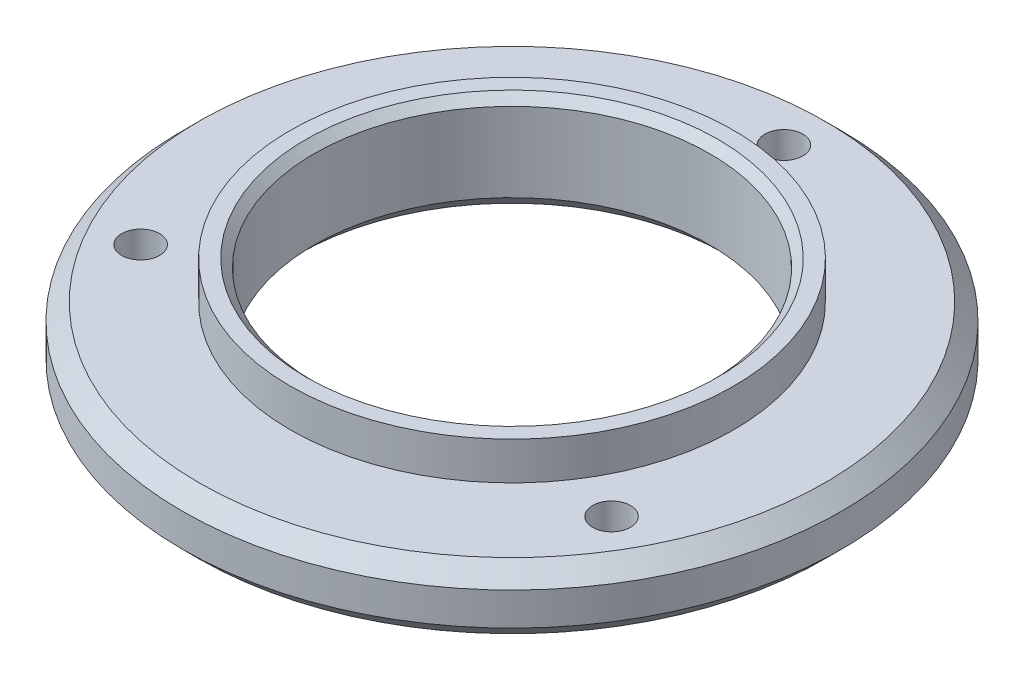
ISO-10303-21;
HEADER;
FILE_DESCRIPTION(('STEP AP214'),'2;1');
FILE_NAME('part.step','',(''),(''),'','','');
FILE_SCHEMA(('AUTOMOTIVE_DESIGN { 1 0 10303 214 1 1 1 1 }'));
ENDSEC;
DATA;
#1=APPLICATION_CONTEXT('core data for automotive mechanical design processes');
#2=APPLICATION_PROTOCOL_DEFINITION('international standard','automotive_design',2000,#1);
#3=PRODUCT_CONTEXT('',#1,'mechanical');
#4=PRODUCT('Part','Part','',(#3));
#5=PRODUCT_RELATED_PRODUCT_CATEGORY('part','',(#4));
#6=PRODUCT_DEFINITION_FORMATION('','',#4);
#7=PRODUCT_DEFINITION_CONTEXT('part definition',#1,'design');
#8=PRODUCT_DEFINITION('design','',#6,#7);
#9=PRODUCT_DEFINITION_SHAPE('','',#8);
#10=(LENGTH_UNIT() NAMED_UNIT(*) SI_UNIT(.MILLI.,.METRE.));
#11=(NAMED_UNIT(*) PLANE_ANGLE_UNIT() SI_UNIT($,.RADIAN.));
#12=(NAMED_UNIT(*) SI_UNIT($,.STERADIAN.) SOLID_ANGLE_UNIT());
#13=UNCERTAINTY_MEASURE_WITH_UNIT(LENGTH_MEASURE(1.E-05),#10,'distance_accuracy_value','');
#14=(GEOMETRIC_REPRESENTATION_CONTEXT(3) GLOBAL_UNCERTAINTY_ASSIGNED_CONTEXT((#13)) GLOBAL_UNIT_ASSIGNED_CONTEXT((#10,
#11,#12)) REPRESENTATION_CONTEXT('',''));
#15=CARTESIAN_POINT('',(0.,0.,0.));
#16=DIRECTION('',(0.,0.,1.));
#17=DIRECTION('',(1.,0.,0.));
#18=AXIS2_PLACEMENT_3D('',#15,#16,#17);
#19=CARTESIAN_POINT('',(0.,4.,-16.5));
#20=DIRECTION('',(0.,-1.,0.));
#21=DIRECTION('',(0.,0.,-1.));
#22=AXIS2_PLACEMENT_3D('',#19,#20,#21);
#23=CYLINDRICAL_SURFACE('',#22,1.15);
#24=CARTESIAN_POINT('',(0.,2.,-16.5));
#25=DIRECTION('',(0.,1.,0.));
#26=DIRECTION('',(0.,0.,1.));
#27=AXIS2_PLACEMENT_3D('',#24,#25,#26);
#28=CIRCLE('',#27,1.15);
#29=CARTESIAN_POINT('',(0.,2.,-15.35));
#30=VERTEX_POINT('',#29);
#31=EDGE_CURVE('E74',#30,#30,#28,.T.);
#32=ORIENTED_EDGE('',*,*,#31,.F.);
#33=EDGE_LOOP('',(#32));
#34=FACE_BOUND('',#33,.T.);
#35=CARTESIAN_POINT('',(0.,4.,-16.5));
#36=DIRECTION('',(0.,1.,0.));
#37=DIRECTION('',(0.,0.,1.));
#38=AXIS2_PLACEMENT_3D('',#35,#36,#37);
#39=CIRCLE('',#38,1.15);
#40=CARTESIAN_POINT('',(0.,4.,-15.35));
#41=VERTEX_POINT('',#40);
#42=EDGE_CURVE('E89',#41,#41,#39,.T.);
#43=ORIENTED_EDGE('',*,*,#42,.T.);
#44=EDGE_LOOP('',(#43));
#45=FACE_BOUND('',#44,.T.);
#46=ADVANCED_FACE('F41',(#34,#45),#23,.F.);
#47=CARTESIAN_POINT('',(14.2894191624432,4.,8.25000000000007));
#48=DIRECTION('',(0.,-1.,0.));
#49=DIRECTION('',(0.,0.,-1.));
#50=AXIS2_PLACEMENT_3D('',#47,#48,#49);
#51=CYLINDRICAL_SURFACE('',#50,1.15);
#52=CARTESIAN_POINT('',(14.2894191624432,2.,8.25000000000007));
#53=DIRECTION('',(0.,1.,0.));
#54=DIRECTION('',(0.,0.,1.));
#55=AXIS2_PLACEMENT_3D('',#52,#53,#54);
#56=CIRCLE('',#55,1.15);
#57=CARTESIAN_POINT('',(14.2894191624432,2.,9.40000000000007));
#58=VERTEX_POINT('',#57);
#59=EDGE_CURVE('E78',#58,#58,#56,.T.);
#60=ORIENTED_EDGE('',*,*,#59,.F.);
#61=EDGE_LOOP('',(#60));
#62=FACE_BOUND('',#61,.T.);
#63=CARTESIAN_POINT('',(14.2894191624432,4.,8.25000000000007));
#64=DIRECTION('',(0.,1.,0.));
#65=DIRECTION('',(0.,0.,1.));
#66=AXIS2_PLACEMENT_3D('',#63,#64,#65);
#67=CIRCLE('',#66,1.15);
#68=CARTESIAN_POINT('',(14.2894191624432,4.,9.40000000000007));
#69=VERTEX_POINT('',#68);
#70=EDGE_CURVE('E92',#69,#69,#67,.T.);
#71=ORIENTED_EDGE('',*,*,#70,.T.);
#72=EDGE_LOOP('',(#71));
#73=FACE_BOUND('',#72,.T.);
#74=ADVANCED_FACE('F139',(#62,#73),#51,.F.);
#75=CARTESIAN_POINT('',(-14.2894191624433,4.,8.24999999999986));
#76=DIRECTION('',(0.,-1.,0.));
#77=DIRECTION('',(0.,0.,-1.));
#78=AXIS2_PLACEMENT_3D('',#75,#76,#77);
#79=CYLINDRICAL_SURFACE('',#78,1.15);
#80=CARTESIAN_POINT('',(-14.2894191624433,2.,8.24999999999986));
#81=DIRECTION('',(0.,1.,0.));
#82=DIRECTION('',(0.,0.,1.));
#83=AXIS2_PLACEMENT_3D('',#80,#81,#82);
#84=CIRCLE('',#83,1.15);
#85=CARTESIAN_POINT('',(-14.2894191624433,2.,9.39999999999986));
#86=VERTEX_POINT('',#85);
#87=EDGE_CURVE('E83',#86,#86,#84,.T.);
#88=ORIENTED_EDGE('',*,*,#87,.F.);
#89=EDGE_LOOP('',(#88));
#90=FACE_BOUND('',#89,.T.);
#91=CARTESIAN_POINT('',(-14.2894191624433,4.,8.24999999999986));
#92=DIRECTION('',(0.,1.,0.));
#93=DIRECTION('',(0.,0.,1.));
#94=AXIS2_PLACEMENT_3D('',#91,#92,#93);
#95=CIRCLE('',#94,1.15);
#96=CARTESIAN_POINT('',(-14.2894191624433,4.,9.39999999999986));
#97=VERTEX_POINT('',#96);
#98=EDGE_CURVE('E87',#97,#97,#95,.T.);
#99=ORIENTED_EDGE('',*,*,#98,.T.);
#100=EDGE_LOOP('',(#99));
#101=FACE_BOUND('',#100,.T.);
#102=ADVANCED_FACE('F147',(#90,#101),#79,.F.);
#103=CARTESIAN_POINT('',(0.,4.,0.));
#104=DIRECTION('',(0.,-1.,0.));
#105=DIRECTION('',(0.,0.,-1.));
#106=AXIS2_PLACEMENT_3D('',#103,#104,#105);
#107=CYLINDRICAL_SURFACE('',#106,12.);
#108=CARTESIAN_POINT('',(0.,1.,0.));
#109=DIRECTION('',(0.,1.,0.));
#110=DIRECTION('',(0.,0.,1.));
#111=AXIS2_PLACEMENT_3D('',#108,#109,#110);
#112=CIRCLE('',#111,12.);
#113=CARTESIAN_POINT('',(0.,1.,12.));
#114=VERTEX_POINT('',#113);
#115=EDGE_CURVE('E10',#114,#114,#112,.F.);
#116=ORIENTED_EDGE('',*,*,#115,.T.);
#117=EDGE_LOOP('',(#116));
#118=FACE_BOUND('',#117,.T.);
#119=CARTESIAN_POINT('',(0.,5.8,0.));
#120=DIRECTION('',(0.,1.,0.));
#121=DIRECTION('',(0.,0.,1.));
#122=AXIS2_PLACEMENT_3D('',#119,#120,#121);
#123=CIRCLE('',#122,12.);
#124=CARTESIAN_POINT('',(0.,5.8,12.));
#125=VERTEX_POINT('',#124);
#126=EDGE_CURVE('E71',#125,#125,#123,.T.);
#127=ORIENTED_EDGE('',*,*,#126,.T.);
#128=EDGE_LOOP('',(#127));
#129=FACE_BOUND('',#128,.T.);
#130=ADVANCED_FACE('F154',(#118,#129),#107,.F.);
#131=CARTESIAN_POINT('',(0.,4.,0.));
#132=DIRECTION('',(0.,-1.,0.));
#133=DIRECTION('',(0.,0.,-1.));
#134=AXIS2_PLACEMENT_3D('',#131,#132,#133);
#135=CYLINDRICAL_SURFACE('',#134,20.);
#136=CARTESIAN_POINT('',(0.,2.99999999999999,0.));
#137=DIRECTION('',(0.,1.,0.));
#138=DIRECTION('',(0.,0.,1.));
#139=AXIS2_PLACEMENT_3D('',#136,#137,#138);
#140=CIRCLE('',#139,20.);
#141=CARTESIAN_POINT('',(0.,2.99999999999999,20.));
#142=VERTEX_POINT('',#141);
#143=EDGE_CURVE('E60',#142,#142,#140,.F.);
#144=ORIENTED_EDGE('',*,*,#143,.T.);
#145=EDGE_LOOP('',(#144));
#146=FACE_BOUND('',#145,.T.);
#147=CARTESIAN_POINT('',(0.,1.00000000000001,0.));
#148=DIRECTION('',(0.,1.,0.));
#149=DIRECTION('',(0.,0.,1.));
#150=AXIS2_PLACEMENT_3D('',#147,#148,#149);
#151=CIRCLE('',#150,20.);
#152=CARTESIAN_POINT('',(0.,1.00000000000001,20.));
#153=VERTEX_POINT('',#152);
#154=EDGE_CURVE('E65',#153,#153,#151,.T.);
#155=ORIENTED_EDGE('',*,*,#154,.T.);
#156=EDGE_LOOP('',(#155));
#157=FACE_BOUND('',#156,.T.);
#158=ADVANCED_FACE('F128',(#146,#157),#135,.T.);
#159=CARTESIAN_POINT('',(0.,4.,0.));
#160=DIRECTION('',(0.,1.,0.));
#161=DIRECTION('',(0.,0.,1.));
#162=AXIS2_PLACEMENT_3D('',#159,#160,#161);
#163=PLANE('',#162);
#164=CARTESIAN_POINT('',(0.,4.,0.));
#165=DIRECTION('',(0.,1.,0.));
#166=DIRECTION('',(0.,0.,1.));
#167=AXIS2_PLACEMENT_3D('',#164,#165,#166);
#168=CIRCLE('',#167,19.);
#169=CARTESIAN_POINT('',(0.,4.,19.));
#170=VERTEX_POINT('',#169);
#171=EDGE_CURVE('E63',#170,#170,#168,.T.);
#172=ORIENTED_EDGE('',*,*,#171,.T.);
#173=EDGE_LOOP('',(#172));
#174=FACE_BOUND('',#173,.T.);
#175=CARTESIAN_POINT('',(0.,4.,0.));
#176=DIRECTION('',(0.,1.,0.));
#177=DIRECTION('',(0.,0.,1.));
#178=AXIS2_PLACEMENT_3D('',#175,#176,#177);
#179=CIRCLE('',#178,13.45);
#180=CARTESIAN_POINT('',(0.,4.,13.45));
#181=VERTEX_POINT('',#180);
#182=EDGE_CURVE('E73',#181,#181,#179,.T.);
#183=ORIENTED_EDGE('',*,*,#182,.F.);
#184=EDGE_LOOP('',(#183));
#185=FACE_BOUND('',#184,.T.);
#186=ORIENTED_EDGE('',*,*,#98,.F.);
#187=EDGE_LOOP('',(#186));
#188=FACE_BOUND('',#187,.T.);
#189=ORIENTED_EDGE('',*,*,#70,.F.);
#190=EDGE_LOOP('',(#189));
#191=FACE_BOUND('',#190,.T.);
#192=ORIENTED_EDGE('',*,*,#42,.F.);
#193=EDGE_LOOP('',(#192));
#194=FACE_BOUND('',#193,.T.);
#195=ADVANCED_FACE('F127',(#174,#185,#188,#191,#194),#163,.T.);
#196=CARTESIAN_POINT('',(0.,0.,0.));
#197=DIRECTION('',(0.,1.,0.));
#198=DIRECTION('',(0.,0.,1.));
#199=AXIS2_PLACEMENT_3D('',#196,#197,#198);
#200=PLANE('',#199);
#201=CARTESIAN_POINT('',(0.,0.,0.));
#202=DIRECTION('',(0.,1.,0.));
#203=DIRECTION('',(0.,0.,1.));
#204=AXIS2_PLACEMENT_3D('',#201,#202,#203);
#205=CIRCLE('',#204,13.);
#206=CARTESIAN_POINT('',(0.,0.,13.));
#207=VERTEX_POINT('',#206);
#208=EDGE_CURVE('E47',#207,#207,#205,.T.);
#209=ORIENTED_EDGE('',*,*,#208,.T.);
#210=EDGE_LOOP('',(#209));
#211=FACE_BOUND('',#210,.T.);
#212=CARTESIAN_POINT('',(0.,0.,0.));
#213=DIRECTION('',(0.,1.,0.));
#214=DIRECTION('',(0.,0.,1.));
#215=AXIS2_PLACEMENT_3D('',#212,#213,#214);
#216=CIRCLE('',#215,19.);
#217=CARTESIAN_POINT('',(0.,0.,19.));
#218=VERTEX_POINT('',#217);
#219=EDGE_CURVE('E52',#218,#218,#216,.F.);
#220=ORIENTED_EDGE('',*,*,#219,.T.);
#221=EDGE_LOOP('',(#220));
#222=FACE_BOUND('',#221,.T.);
#223=CARTESIAN_POINT('',(0.,0.,-16.5));
#224=DIRECTION('',(0.,-1.,0.));
#225=DIRECTION('',(0.,0.,-1.));
#226=AXIS2_PLACEMENT_3D('',#223,#224,#225);
#227=CIRCLE('',#226,2.2);
#228=CARTESIAN_POINT('',(0.,0.,-18.7));
#229=VERTEX_POINT('',#228);
#230=EDGE_CURVE('E79',#229,#229,#227,.T.);
#231=ORIENTED_EDGE('',*,*,#230,.F.);
#232=EDGE_LOOP('',(#231));
#233=FACE_BOUND('',#232,.T.);
#234=CARTESIAN_POINT('',(14.2894191624432,0.,8.25000000000007));
#235=DIRECTION('',(0.,-1.,0.));
#236=DIRECTION('',(0.,0.,-1.));
#237=AXIS2_PLACEMENT_3D('',#234,#235,#236);
#238=CIRCLE('',#237,2.2);
#239=CARTESIAN_POINT('',(14.2894191624432,0.,6.05000000000007));
#240=VERTEX_POINT('',#239);
#241=EDGE_CURVE('E81',#240,#240,#238,.T.);
#242=ORIENTED_EDGE('',*,*,#241,.F.);
#243=EDGE_LOOP('',(#242));
#244=FACE_BOUND('',#243,.T.);
#245=CARTESIAN_POINT('',(-14.2894191624433,0.,8.24999999999986));
#246=DIRECTION('',(0.,-1.,0.));
#247=DIRECTION('',(0.,0.,-1.));
#248=AXIS2_PLACEMENT_3D('',#245,#246,#247);
#249=CIRCLE('',#248,2.2);
#250=CARTESIAN_POINT('',(-14.2894191624433,0.,6.04999999999986));
#251=VERTEX_POINT('',#250);
#252=EDGE_CURVE('E88',#251,#251,#249,.T.);
#253=ORIENTED_EDGE('',*,*,#252,.F.);
#254=EDGE_LOOP('',(#253));
#255=FACE_BOUND('',#254,.T.);
#256=ADVANCED_FACE('F126',(#211,#222,#233,#244,#255),#200,.F.);
#257=CARTESIAN_POINT('',(-14.2894191624433,0.,8.24999999999986));
#258=DIRECTION('',(0.,-1.,0.));
#259=DIRECTION('',(0.,0.,-1.));
#260=AXIS2_PLACEMENT_3D('',#257,#258,#259);
#261=CYLINDRICAL_SURFACE('',#260,2.2);
#262=CARTESIAN_POINT('',(-14.2894191624433,2.,8.24999999999986));
#263=DIRECTION('',(0.,-1.,0.));
#264=DIRECTION('',(0.,0.,-1.));
#265=AXIS2_PLACEMENT_3D('',#262,#263,#264);
#266=CIRCLE('',#265,2.2);
#267=CARTESIAN_POINT('',(-14.2894191624433,2.,6.04999999999986));
#268=VERTEX_POINT('',#267);
#269=EDGE_CURVE('E84',#268,#268,#266,.T.);
#270=ORIENTED_EDGE('',*,*,#269,.F.);
#271=EDGE_LOOP('',(#270));
#272=FACE_BOUND('',#271,.T.);
#273=ORIENTED_EDGE('',*,*,#252,.T.);
#274=EDGE_LOOP('',(#273));
#275=FACE_BOUND('',#274,.T.);
#276=ADVANCED_FACE('F209',(#272,#275),#261,.F.);
#277=CARTESIAN_POINT('',(-12.0894191624433,2.,8.24999999999986));
#278=DIRECTION('',(0.,1.,0.));
#279=DIRECTION('',(0.,0.,1.));
#280=AXIS2_PLACEMENT_3D('',#277,#278,#279);
#281=PLANE('',#280);
#282=ORIENTED_EDGE('',*,*,#87,.T.);
#283=EDGE_LOOP('',(#282));
#284=FACE_BOUND('',#283,.T.);
#285=ORIENTED_EDGE('',*,*,#269,.T.);
#286=EDGE_LOOP('',(#285));
#287=FACE_BOUND('',#286,.T.);
#288=ADVANCED_FACE('F292',(#284,#287),#281,.F.);
#289=CARTESIAN_POINT('',(14.2894191624432,0.,8.25000000000007));
#290=DIRECTION('',(0.,-1.,0.));
#291=DIRECTION('',(0.,0.,-1.));
#292=AXIS2_PLACEMENT_3D('',#289,#290,#291);
#293=CYLINDRICAL_SURFACE('',#292,2.2);
#294=CARTESIAN_POINT('',(14.2894191624432,2.,8.25000000000007));
#295=DIRECTION('',(0.,-1.,0.));
#296=DIRECTION('',(0.,0.,-1.));
#297=AXIS2_PLACEMENT_3D('',#294,#295,#296);
#298=CIRCLE('',#297,2.2);
#299=CARTESIAN_POINT('',(14.2894191624432,2.,6.05000000000007));
#300=VERTEX_POINT('',#299);
#301=EDGE_CURVE('E76',#300,#300,#298,.T.);
#302=ORIENTED_EDGE('',*,*,#301,.F.);
#303=EDGE_LOOP('',(#302));
#304=FACE_BOUND('',#303,.T.);
#305=ORIENTED_EDGE('',*,*,#241,.T.);
#306=EDGE_LOOP('',(#305));
#307=FACE_BOUND('',#306,.T.);
#308=ADVANCED_FACE('F285',(#304,#307),#293,.F.);
#309=CARTESIAN_POINT('',(16.4894191624432,2.,8.25000000000007));
#310=DIRECTION('',(0.,1.,0.));
#311=DIRECTION('',(0.,0.,1.));
#312=AXIS2_PLACEMENT_3D('',#309,#310,#311);
#313=PLANE('',#312);
#314=ORIENTED_EDGE('',*,*,#59,.T.);
#315=EDGE_LOOP('',(#314));
#316=FACE_BOUND('',#315,.T.);
#317=ORIENTED_EDGE('',*,*,#301,.T.);
#318=EDGE_LOOP('',(#317));
#319=FACE_BOUND('',#318,.T.);
#320=ADVANCED_FACE('F275',(#316,#319),#313,.F.);
#321=CARTESIAN_POINT('',(0.,0.,-16.5));
#322=DIRECTION('',(0.,-1.,0.));
#323=DIRECTION('',(0.,0.,-1.));
#324=AXIS2_PLACEMENT_3D('',#321,#322,#323);
#325=CYLINDRICAL_SURFACE('',#324,2.2);
#326=CARTESIAN_POINT('',(0.,2.,-16.5));
#327=DIRECTION('',(0.,-1.,0.));
#328=DIRECTION('',(0.,0.,-1.));
#329=AXIS2_PLACEMENT_3D('',#326,#327,#328);
#330=CIRCLE('',#329,2.2);
#331=CARTESIAN_POINT('',(0.,2.,-18.7));
#332=VERTEX_POINT('',#331);
#333=EDGE_CURVE('E108',#332,#332,#330,.T.);
#334=ORIENTED_EDGE('',*,*,#333,.F.);
#335=EDGE_LOOP('',(#334));
#336=FACE_BOUND('',#335,.T.);
#337=ORIENTED_EDGE('',*,*,#230,.T.);
#338=EDGE_LOOP('',(#337));
#339=FACE_BOUND('',#338,.T.);
#340=ADVANCED_FACE('F265',(#336,#339),#325,.F.);
#341=CARTESIAN_POINT('',(2.2,2.,-16.5));
#342=DIRECTION('',(0.,1.,0.));
#343=DIRECTION('',(0.,0.,1.));
#344=AXIS2_PLACEMENT_3D('',#341,#342,#343);
#345=PLANE('',#344);
#346=ORIENTED_EDGE('',*,*,#31,.T.);
#347=EDGE_LOOP('',(#346));
#348=FACE_BOUND('',#347,.T.);
#349=ORIENTED_EDGE('',*,*,#333,.T.);
#350=EDGE_LOOP('',(#349));
#351=FACE_BOUND('',#350,.T.);
#352=ADVANCED_FACE('F246',(#348,#351),#345,.F.);
#353=CARTESIAN_POINT('',(0.,6.3,0.));
#354=DIRECTION('',(0.,1.,0.));
#355=DIRECTION('',(0.,0.,1.));
#356=AXIS2_PLACEMENT_3D('',#353,#354,#355);
#357=PLANE('',#356);
#358=CARTESIAN_POINT('',(0.,6.3,0.));
#359=DIRECTION('',(0.,1.,0.));
#360=DIRECTION('',(0.,0.,1.));
#361=AXIS2_PLACEMENT_3D('',#358,#359,#360);
#362=CIRCLE('',#361,12.5);
#363=CARTESIAN_POINT('',(0.,6.3,12.5));
#364=VERTEX_POINT('',#363);
#365=EDGE_CURVE('E67',#364,#364,#362,.F.);
#366=ORIENTED_EDGE('',*,*,#365,.T.);
#367=EDGE_LOOP('',(#366));
#368=FACE_BOUND('',#367,.T.);
#369=CARTESIAN_POINT('',(0.,6.3,0.));
#370=DIRECTION('',(0.,1.,0.));
#371=DIRECTION('',(0.,0.,1.));
#372=AXIS2_PLACEMENT_3D('',#369,#370,#371);
#373=CIRCLE('',#372,13.45);
#374=CARTESIAN_POINT('',(0.,6.3,13.45));
#375=VERTEX_POINT('',#374);
#376=EDGE_CURVE('E111',#375,#375,#373,.T.);
#377=ORIENTED_EDGE('',*,*,#376,.T.);
#378=EDGE_LOOP('',(#377));
#379=FACE_BOUND('',#378,.T.);
#380=ADVANCED_FACE('F120',(#368,#379),#357,.T.);
#381=CARTESIAN_POINT('',(0.,6.3,0.));
#382=DIRECTION('',(0.,-1.,0.));
#383=DIRECTION('',(0.,0.,-1.));
#384=AXIS2_PLACEMENT_3D('',#381,#382,#383);
#385=CYLINDRICAL_SURFACE('',#384,13.45);
#386=ORIENTED_EDGE('',*,*,#376,.F.);
#387=EDGE_LOOP('',(#386));
#388=FACE_BOUND('',#387,.T.);
#389=ORIENTED_EDGE('',*,*,#182,.T.);
#390=EDGE_LOOP('',(#389));
#391=FACE_BOUND('',#390,.T.);
#392=ADVANCED_FACE('F118',(#388,#391),#385,.T.);
#393=CARTESIAN_POINT('',(0.,5.8,0.));
#394=DIRECTION('',(0.,1.,0.));
#395=DIRECTION('',(0.,0.,1.));
#396=AXIS2_PLACEMENT_3D('',#393,#394,#395);
#397=CONICAL_SURFACE('',#396,12.,0.785398163397448);
#398=ORIENTED_EDGE('',*,*,#365,.F.);
#399=EDGE_LOOP('',(#398));
#400=FACE_BOUND('',#399,.T.);
#401=ORIENTED_EDGE('',*,*,#126,.F.);
#402=EDGE_LOOP('',(#401));
#403=FACE_BOUND('',#402,.T.);
#404=ADVANCED_FACE('F125',(#400,#403),#397,.F.);
#405=CARTESIAN_POINT('',(0.,4.,0.));
#406=DIRECTION('',(0.,-1.,0.));
#407=DIRECTION('',(0.,0.,-1.));
#408=AXIS2_PLACEMENT_3D('',#405,#406,#407);
#409=CONICAL_SURFACE('',#408,19.,0.785398163397445);
#410=ORIENTED_EDGE('',*,*,#143,.F.);
#411=EDGE_LOOP('',(#410));
#412=FACE_BOUND('',#411,.T.);
#413=ORIENTED_EDGE('',*,*,#171,.F.);
#414=EDGE_LOOP('',(#413));
#415=FACE_BOUND('',#414,.T.);
#416=ADVANCED_FACE('F164',(#412,#415),#409,.T.);
#417=CARTESIAN_POINT('',(0.,0.,0.));
#418=DIRECTION('',(0.,-1.,0.));
#419=DIRECTION('',(0.,0.,-1.));
#420=AXIS2_PLACEMENT_3D('',#417,#418,#419);
#421=CONICAL_SURFACE('',#420,13.,0.785398163397447);
#422=ORIENTED_EDGE('',*,*,#115,.F.);
#423=EDGE_LOOP('',(#422));
#424=FACE_BOUND('',#423,.T.);
#425=ORIENTED_EDGE('',*,*,#208,.F.);
#426=EDGE_LOOP('',(#425));
#427=FACE_BOUND('',#426,.T.);
#428=ADVANCED_FACE('F171',(#424,#427),#421,.F.);
#429=CARTESIAN_POINT('',(0.,1.00000000000001,0.));
#430=DIRECTION('',(0.,1.,0.));
#431=DIRECTION('',(0.,0.,1.));
#432=AXIS2_PLACEMENT_3D('',#429,#430,#431);
#433=CONICAL_SURFACE('',#432,20.,0.78539816339745);
#434=ORIENTED_EDGE('',*,*,#219,.F.);
#435=EDGE_LOOP('',(#434));
#436=FACE_BOUND('',#435,.T.);
#437=ORIENTED_EDGE('',*,*,#154,.F.);
#438=EDGE_LOOP('',(#437));
#439=FACE_BOUND('',#438,.T.);
#440=ADVANCED_FACE('F42',(#436,#439),#433,.T.);
#441=CLOSED_SHELL('',(#46,#74,#102,#130,#158,#195,#256,#276,#288,#308,#320,#340,#352,#380,#392,
#404,#416,#428,#440));
#442=MANIFOLD_SOLID_BREP('B2',#441);
#443=ADVANCED_BREP_SHAPE_REPRESENTATION('',(#18,#442),#14);
#444=SHAPE_DEFINITION_REPRESENTATION(#9,#443);
ENDSEC;
END-ISO-10303-21;
